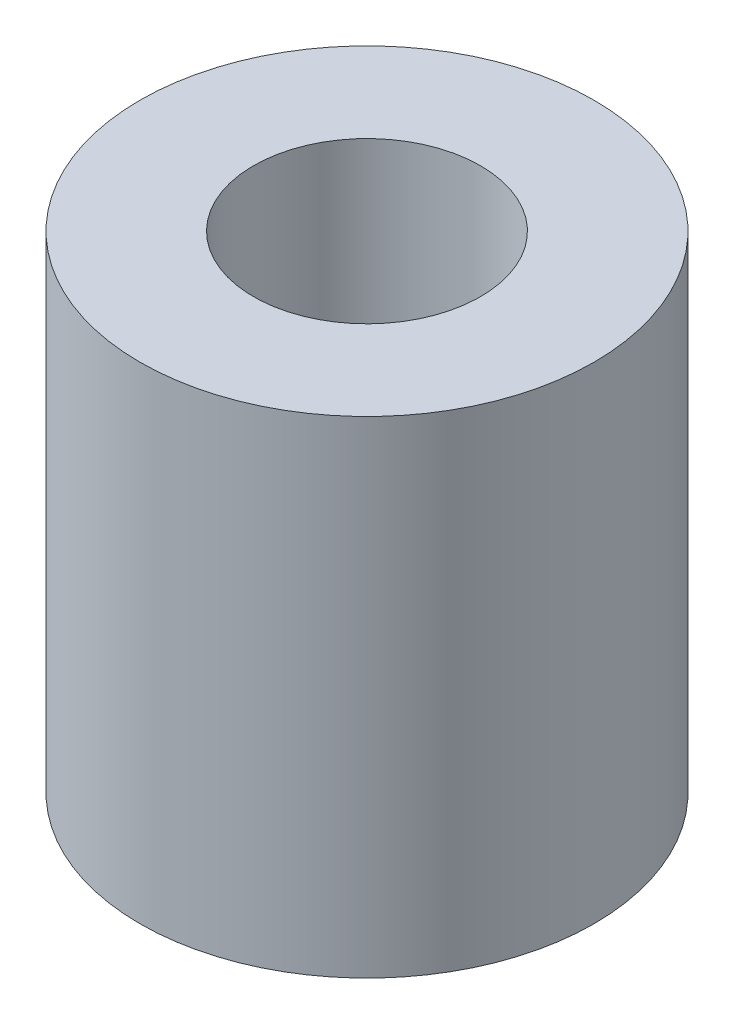
ISO-10303-21;
HEADER;
FILE_DESCRIPTION(('STEP AP214'),'2;1');
FILE_NAME('part.step','',(''),(''),'','','');
FILE_SCHEMA(('AUTOMOTIVE_DESIGN { 1 0 10303 214 1 1 1 1 }'));
ENDSEC;
DATA;
#1=APPLICATION_CONTEXT('core data for automotive mechanical design processes');
#2=APPLICATION_PROTOCOL_DEFINITION('international standard','automotive_design',2000,#1);
#3=PRODUCT_CONTEXT('',#1,'mechanical');
#4=PRODUCT('Part','Part','',(#3));
#5=PRODUCT_RELATED_PRODUCT_CATEGORY('part','',(#4));
#6=PRODUCT_DEFINITION_FORMATION('','',#4);
#7=PRODUCT_DEFINITION_CONTEXT('part definition',#1,'design');
#8=PRODUCT_DEFINITION('design','',#6,#7);
#9=PRODUCT_DEFINITION_SHAPE('','',#8);
#10=(LENGTH_UNIT() NAMED_UNIT(*) SI_UNIT(.MILLI.,.METRE.));
#11=(NAMED_UNIT(*) PLANE_ANGLE_UNIT() SI_UNIT($,.RADIAN.));
#12=(NAMED_UNIT(*) SI_UNIT($,.STERADIAN.) SOLID_ANGLE_UNIT());
#13=UNCERTAINTY_MEASURE_WITH_UNIT(LENGTH_MEASURE(1.E-05),#10,'distance_accuracy_value','');
#14=(GEOMETRIC_REPRESENTATION_CONTEXT(3) GLOBAL_UNCERTAINTY_ASSIGNED_CONTEXT((#13)) GLOBAL_UNIT_ASSIGNED_CONTEXT((#10,
#11,#12)) REPRESENTATION_CONTEXT('',''));
#15=CARTESIAN_POINT('',(0.,0.,0.));
#16=DIRECTION('',(0.,0.,1.));
#17=DIRECTION('',(1.,0.,0.));
#18=AXIS2_PLACEMENT_3D('',#15,#16,#17);
#19=CARTESIAN_POINT('',(-7.,0.,0.));
#20=DIRECTION('',(0.,1.,0.));
#21=DIRECTION('',(0.,0.,1.));
#22=AXIS2_PLACEMENT_3D('',#19,#20,#21);
#23=PLANE('',#22);
#24=CARTESIAN_POINT('',(0.,0.,0.));
#25=DIRECTION('',(0.,-1.,0.));
#26=DIRECTION('',(0.,0.,-1.));
#27=AXIS2_PLACEMENT_3D('',#24,#25,#26);
#28=CIRCLE('',#27,7.);
#29=CARTESIAN_POINT('',(0.,0.,-7.));
#30=VERTEX_POINT('',#29);
#31=EDGE_CURVE('E65',#30,#30,#28,.T.);
#32=ORIENTED_EDGE('',*,*,#31,.F.);
#33=EDGE_LOOP('',(#32));
#34=FACE_BOUND('',#33,.T.);
#35=CARTESIAN_POINT('',(0.,0.,0.));
#36=DIRECTION('',(0.,-1.,0.));
#37=DIRECTION('',(0.,0.,-1.));
#38=AXIS2_PLACEMENT_3D('',#35,#36,#37);
#39=CIRCLE('',#38,14.);
#40=CARTESIAN_POINT('',(0.,0.,-14.));
#41=VERTEX_POINT('',#40);
#42=EDGE_CURVE('E10',#41,#41,#39,.T.);
#43=ORIENTED_EDGE('',*,*,#42,.T.);
#44=EDGE_LOOP('',(#43));
#45=FACE_BOUND('',#44,.T.);
#46=ADVANCED_FACE('F47',(#34,#45),#23,.F.);
#47=CARTESIAN_POINT('',(0.,0.,0.));
#48=DIRECTION('',(0.,-1.,0.));
#49=DIRECTION('',(0.,0.,-1.));
#50=AXIS2_PLACEMENT_3D('',#47,#48,#49);
#51=CYLINDRICAL_SURFACE('',#50,14.);
#52=ORIENTED_EDGE('',*,*,#42,.F.);
#53=EDGE_LOOP('',(#52));
#54=FACE_BOUND('',#53,.T.);
#55=CARTESIAN_POINT('',(0.,30.,0.));
#56=DIRECTION('',(0.,-1.,0.));
#57=DIRECTION('',(0.,0.,-1.));
#58=AXIS2_PLACEMENT_3D('',#55,#56,#57);
#59=CIRCLE('',#58,14.);
#60=CARTESIAN_POINT('',(0.,30.,-14.));
#61=VERTEX_POINT('',#60);
#62=EDGE_CURVE('E54',#61,#61,#59,.T.);
#63=ORIENTED_EDGE('',*,*,#62,.T.);
#64=EDGE_LOOP('',(#63));
#65=FACE_BOUND('',#64,.T.);
#66=ADVANCED_FACE('F74',(#54,#65),#51,.T.);
#67=CARTESIAN_POINT('',(-14.,30.,0.));
#68=DIRECTION('',(0.,-1.,0.));
#69=DIRECTION('',(0.,0.,-1.));
#70=AXIS2_PLACEMENT_3D('',#67,#68,#69);
#71=PLANE('',#70);
#72=ORIENTED_EDGE('',*,*,#62,.F.);
#73=EDGE_LOOP('',(#72));
#74=FACE_BOUND('',#73,.T.);
#75=CARTESIAN_POINT('',(0.,30.,0.));
#76=DIRECTION('',(0.,-1.,0.));
#77=DIRECTION('',(0.,0.,-1.));
#78=AXIS2_PLACEMENT_3D('',#75,#76,#77);
#79=CIRCLE('',#78,7.);
#80=CARTESIAN_POINT('',(0.,30.,-7.));
#81=VERTEX_POINT('',#80);
#82=EDGE_CURVE('E60',#81,#81,#79,.T.);
#83=ORIENTED_EDGE('',*,*,#82,.T.);
#84=EDGE_LOOP('',(#83));
#85=FACE_BOUND('',#84,.T.);
#86=ADVANCED_FACE('F78',(#74,#85),#71,.F.);
#87=CARTESIAN_POINT('',(0.,0.,0.));
#88=DIRECTION('',(0.,-1.,0.));
#89=DIRECTION('',(0.,0.,-1.));
#90=AXIS2_PLACEMENT_3D('',#87,#88,#89);
#91=CYLINDRICAL_SURFACE('',#90,7.);
#92=ORIENTED_EDGE('',*,*,#82,.F.);
#93=EDGE_LOOP('',(#92));
#94=FACE_BOUND('',#93,.T.);
#95=ORIENTED_EDGE('',*,*,#31,.T.);
#96=EDGE_LOOP('',(#95));
#97=FACE_BOUND('',#96,.T.);
#98=ADVANCED_FACE('F71',(#94,#97),#91,.F.);
#99=CLOSED_SHELL('',(#46,#66,#86,#98));
#100=MANIFOLD_SOLID_BREP('B2',#99);
#101=ADVANCED_BREP_SHAPE_REPRESENTATION('',(#18,#100),#14);
#102=SHAPE_DEFINITION_REPRESENTATION(#9,#101);
ENDSEC;
END-ISO-10303-21;
